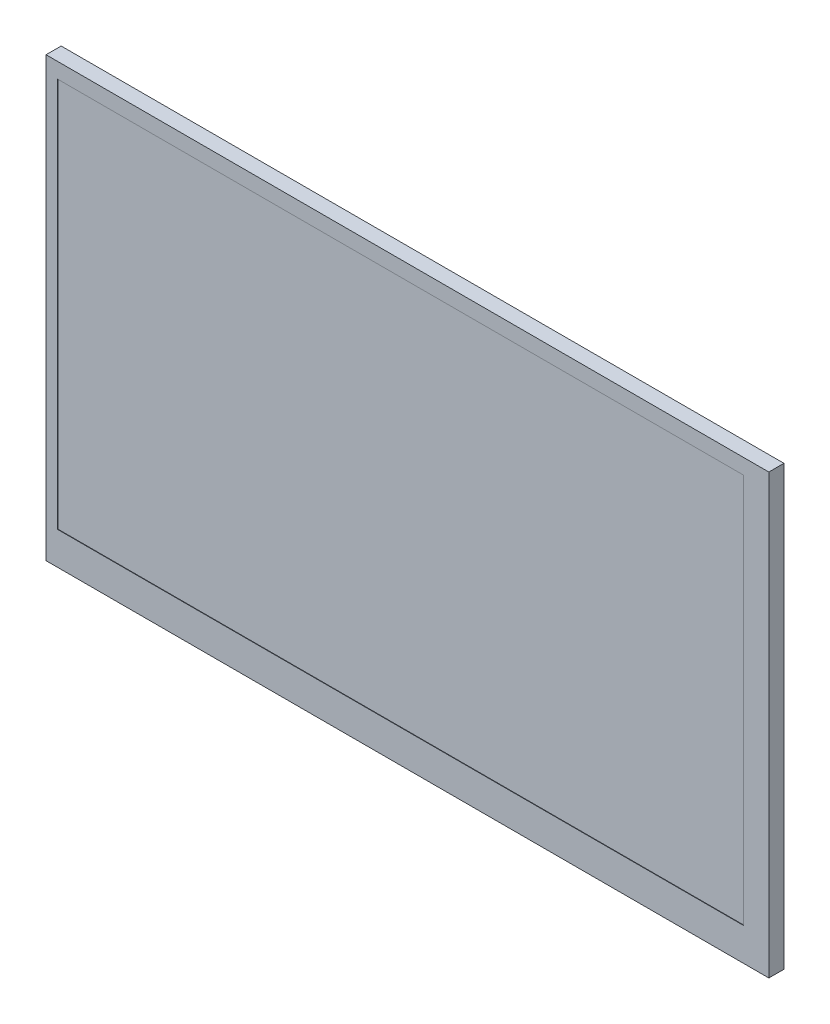
ISO-10303-21;
HEADER;
FILE_DESCRIPTION(('STEP AP214'),'2;1');
FILE_NAME('part.step','',(''),(''),'','','');
FILE_SCHEMA(('AUTOMOTIVE_DESIGN { 1 0 10303 214 1 1 1 1 }'));
ENDSEC;
DATA;
#1=APPLICATION_CONTEXT('core data for automotive mechanical design processes');
#2=APPLICATION_PROTOCOL_DEFINITION('international standard','automotive_design',2000,#1);
#3=PRODUCT_CONTEXT('',#1,'mechanical');
#4=PRODUCT('Part','Part','',(#3));
#5=PRODUCT_RELATED_PRODUCT_CATEGORY('part','',(#4));
#6=PRODUCT_DEFINITION_FORMATION('','',#4);
#7=PRODUCT_DEFINITION_CONTEXT('part definition',#1,'design');
#8=PRODUCT_DEFINITION('design','',#6,#7);
#9=PRODUCT_DEFINITION_SHAPE('','',#8);
#10=(LENGTH_UNIT() NAMED_UNIT(*) SI_UNIT(.MILLI.,.METRE.));
#11=(NAMED_UNIT(*) PLANE_ANGLE_UNIT() SI_UNIT($,.RADIAN.));
#12=(NAMED_UNIT(*) SI_UNIT($,.STERADIAN.) SOLID_ANGLE_UNIT());
#13=UNCERTAINTY_MEASURE_WITH_UNIT(LENGTH_MEASURE(1.E-05),#10,'distance_accuracy_value','');
#14=(GEOMETRIC_REPRESENTATION_CONTEXT(3) GLOBAL_UNCERTAINTY_ASSIGNED_CONTEXT((#13)) GLOBAL_UNIT_ASSIGNED_CONTEXT((#10,
#11,#12)) REPRESENTATION_CONTEXT('',''));
#15=CARTESIAN_POINT('',(0.,0.,0.));
#16=DIRECTION('',(0.,0.,1.));
#17=DIRECTION('',(1.,0.,0.));
#18=AXIS2_PLACEMENT_3D('',#15,#16,#17);
#19=CARTESIAN_POINT('',(-82.475,50.,4.4));
#20=DIRECTION('',(0.,0.,-1.));
#21=DIRECTION('',(-1.,0.,0.));
#22=AXIS2_PLACEMENT_3D('',#19,#20,#21);
#23=PLANE('',#22);
#24=DIRECTION('',(0.,-1.,0.));
#25=VECTOR('',#24,1.);
#26=CARTESIAN_POINT('',(-82.475,-50.,4.4));
#27=LINE('',#26,#25);
#28=CARTESIAN_POINT('',(-82.475,50.,4.4));
#29=VERTEX_POINT('',#28);
#30=CARTESIAN_POINT('',(-82.475,-50.,4.4));
#31=VERTEX_POINT('',#30);
#32=EDGE_CURVE('E136',#29,#31,#27,.T.);
#33=ORIENTED_EDGE('',*,*,#32,.F.);
#34=DIRECTION('',(-1.,0.,0.));
#35=VECTOR('',#34,1.);
#36=CARTESIAN_POINT('',(82.475,50.,4.4));
#37=LINE('',#36,#35);
#38=CARTESIAN_POINT('',(82.475,50.,4.4));
#39=VERTEX_POINT('',#38);
#40=EDGE_CURVE('E142',#39,#29,#37,.T.);
#41=ORIENTED_EDGE('',*,*,#40,.F.);
#42=DIRECTION('',(0.,1.,0.));
#43=VECTOR('',#42,1.);
#44=CARTESIAN_POINT('',(82.4749999999999,-50.,4.4));
#45=LINE('',#44,#43);
#46=CARTESIAN_POINT('',(82.4749999999999,-50.,4.4));
#47=VERTEX_POINT('',#46);
#48=EDGE_CURVE('E154',#47,#39,#45,.T.);
#49=ORIENTED_EDGE('',*,*,#48,.F.);
#50=DIRECTION('',(1.,0.,0.));
#51=VECTOR('',#50,1.);
#52=CARTESIAN_POINT('',(82.4749999999999,-50.,4.4));
#53=LINE('',#52,#51);
#54=EDGE_CURVE('E152',#31,#47,#53,.T.);
#55=ORIENTED_EDGE('',*,*,#54,.F.);
#56=EDGE_LOOP('',(#33,#41,#49,#55));
#57=FACE_BOUND('',#56,.T.);
#58=ADVANCED_FACE('F40',(#57),#23,.T.);
#59=CARTESIAN_POINT('',(0.,0.,7.75));
#60=DIRECTION('',(0.,0.,1.));
#61=DIRECTION('',(1.,0.,0.));
#62=AXIS2_PLACEMENT_3D('',#59,#60,#61);
#63=PLANE('',#62);
#64=DIRECTION('',(0.,-1.,0.));
#65=VECTOR('',#64,1.);
#66=CARTESIAN_POINT('',(-79.855,46.5,7.75));
#67=LINE('',#66,#65);
#68=CARTESIAN_POINT('',(-79.855,46.5,7.75));
#69=VERTEX_POINT('',#68);
#70=CARTESIAN_POINT('',(-79.855,-42.5,7.75));
#71=VERTEX_POINT('',#70);
#72=EDGE_CURVE('E43',#69,#71,#67,.T.);
#73=ORIENTED_EDGE('',*,*,#72,.T.);
#74=DIRECTION('',(1.,0.,0.));
#75=VECTOR('',#74,1.);
#76=CARTESIAN_POINT('',(-79.855,-42.5,7.75));
#77=LINE('',#76,#75);
#78=CARTESIAN_POINT('',(76.645,-42.5,7.75));
#79=VERTEX_POINT('',#78);
#80=EDGE_CURVE('E115',#71,#79,#77,.T.);
#81=ORIENTED_EDGE('',*,*,#80,.T.);
#82=DIRECTION('',(0.,1.,0.));
#83=VECTOR('',#82,1.);
#84=CARTESIAN_POINT('',(76.645,46.5,7.75));
#85=LINE('',#84,#83);
#86=CARTESIAN_POINT('',(76.645,46.5,7.75));
#87=VERTEX_POINT('',#86);
#88=EDGE_CURVE('E129',#79,#87,#85,.T.);
#89=ORIENTED_EDGE('',*,*,#88,.T.);
#90=DIRECTION('',(-1.,0.,0.));
#91=VECTOR('',#90,1.);
#92=CARTESIAN_POINT('',(-79.855,46.5,7.75));
#93=LINE('',#92,#91);
#94=EDGE_CURVE('E117',#87,#69,#93,.T.);
#95=ORIENTED_EDGE('',*,*,#94,.T.);
#96=EDGE_LOOP('',(#73,#81,#89,#95));
#97=FACE_BOUND('',#96,.T.);
#98=ADVANCED_FACE('F196',(#97),#63,.T.);
#99=CARTESIAN_POINT('',(-79.855,-42.5,7.75));
#100=DIRECTION('',(0.,-1.,0.));
#101=DIRECTION('',(0.,0.,-1.));
#102=AXIS2_PLACEMENT_3D('',#99,#100,#101);
#103=PLANE('',#102);
#104=DIRECTION('',(1.,0.,0.));
#105=VECTOR('',#104,1.);
#106=CARTESIAN_POINT('',(-79.855,-42.5,7.85));
#107=LINE('',#106,#105);
#108=CARTESIAN_POINT('',(-79.855,-42.5,7.85));
#109=VERTEX_POINT('',#108);
#110=CARTESIAN_POINT('',(76.645,-42.5,7.85));
#111=VERTEX_POINT('',#110);
#112=EDGE_CURVE('E49',#109,#111,#107,.T.);
#113=ORIENTED_EDGE('',*,*,#112,.T.);
#114=DIRECTION('',(0.,0.,1.));
#115=VECTOR('',#114,1.);
#116=CARTESIAN_POINT('',(76.645,-42.5,7.75));
#117=LINE('',#116,#115);
#118=EDGE_CURVE('E58',#79,#111,#117,.T.);
#119=ORIENTED_EDGE('',*,*,#118,.F.);
#120=ORIENTED_EDGE('',*,*,#80,.F.);
#121=DIRECTION('',(0.,0.,1.));
#122=VECTOR('',#121,1.);
#123=CARTESIAN_POINT('',(-79.855,-42.5,7.75));
#124=LINE('',#123,#122);
#125=EDGE_CURVE('E78',#71,#109,#124,.T.);
#126=ORIENTED_EDGE('',*,*,#125,.T.);
#127=EDGE_LOOP('',(#113,#119,#120,#126));
#128=FACE_BOUND('',#127,.T.);
#129=ADVANCED_FACE('F112',(#128),#103,.F.);
#130=CARTESIAN_POINT('',(76.645,46.5,7.75));
#131=DIRECTION('',(1.,0.,0.));
#132=DIRECTION('',(0.,0.,-1.));
#133=AXIS2_PLACEMENT_3D('',#130,#131,#132);
#134=PLANE('',#133);
#135=DIRECTION('',(0.,1.,0.));
#136=VECTOR('',#135,1.);
#137=CARTESIAN_POINT('',(76.645,46.5,7.85));
#138=LINE('',#137,#136);
#139=CARTESIAN_POINT('',(76.645,46.5,7.85));
#140=VERTEX_POINT('',#139);
#141=EDGE_CURVE('E121',#111,#140,#138,.T.);
#142=ORIENTED_EDGE('',*,*,#141,.T.);
#143=DIRECTION('',(0.,0.,1.));
#144=VECTOR('',#143,1.);
#145=CARTESIAN_POINT('',(76.645,46.5,7.75));
#146=LINE('',#145,#144);
#147=EDGE_CURVE('E135',#87,#140,#146,.T.);
#148=ORIENTED_EDGE('',*,*,#147,.F.);
#149=ORIENTED_EDGE('',*,*,#88,.F.);
#150=ORIENTED_EDGE('',*,*,#118,.T.);
#151=EDGE_LOOP('',(#142,#148,#149,#150));
#152=FACE_BOUND('',#151,.T.);
#153=ADVANCED_FACE('F202',(#152),#134,.F.);
#154=CARTESIAN_POINT('',(-79.855,46.5,7.75));
#155=DIRECTION('',(0.,1.,0.));
#156=DIRECTION('',(0.,0.,1.));
#157=AXIS2_PLACEMENT_3D('',#154,#155,#156);
#158=PLANE('',#157);
#159=DIRECTION('',(-1.,0.,0.));
#160=VECTOR('',#159,1.);
#161=CARTESIAN_POINT('',(-79.855,46.5,7.85));
#162=LINE('',#161,#160);
#163=CARTESIAN_POINT('',(-79.855,46.5,7.85));
#164=VERTEX_POINT('',#163);
#165=EDGE_CURVE('E123',#140,#164,#162,.T.);
#166=ORIENTED_EDGE('',*,*,#165,.T.);
#167=DIRECTION('',(0.,0.,1.));
#168=VECTOR('',#167,1.);
#169=CARTESIAN_POINT('',(-79.855,46.5,7.75));
#170=LINE('',#169,#168);
#171=EDGE_CURVE('E80',#69,#164,#170,.T.);
#172=ORIENTED_EDGE('',*,*,#171,.F.);
#173=ORIENTED_EDGE('',*,*,#94,.F.);
#174=ORIENTED_EDGE('',*,*,#147,.T.);
#175=EDGE_LOOP('',(#166,#172,#173,#174));
#176=FACE_BOUND('',#175,.T.);
#177=ADVANCED_FACE('F205',(#176),#158,.F.);
#178=CARTESIAN_POINT('',(-79.855,46.5,7.75));
#179=DIRECTION('',(-1.,0.,0.));
#180=DIRECTION('',(0.,-1.,0.));
#181=AXIS2_PLACEMENT_3D('',#178,#179,#180);
#182=PLANE('',#181);
#183=DIRECTION('',(0.,-1.,0.));
#184=VECTOR('',#183,1.);
#185=CARTESIAN_POINT('',(-79.855,46.5,7.85));
#186=LINE('',#185,#184);
#187=EDGE_CURVE('E11',#164,#109,#186,.T.);
#188=ORIENTED_EDGE('',*,*,#187,.T.);
#189=ORIENTED_EDGE('',*,*,#125,.F.);
#190=ORIENTED_EDGE('',*,*,#72,.F.);
#191=ORIENTED_EDGE('',*,*,#171,.T.);
#192=EDGE_LOOP('',(#188,#189,#190,#191));
#193=FACE_BOUND('',#192,.T.);
#194=ADVANCED_FACE('F108',(#193),#182,.F.);
#195=CARTESIAN_POINT('',(82.4749999999999,-50.,7.85));
#196=DIRECTION('',(0.,1.,0.));
#197=DIRECTION('',(-1.,0.,0.));
#198=AXIS2_PLACEMENT_3D('',#195,#196,#197);
#199=PLANE('',#198);
#200=ORIENTED_EDGE('',*,*,#54,.T.);
#201=DIRECTION('',(0.,0.,-1.));
#202=VECTOR('',#201,1.);
#203=CARTESIAN_POINT('',(82.4749999999999,-50.,7.85));
#204=LINE('',#203,#202);
#205=CARTESIAN_POINT('',(82.4749999999999,-50.,7.85));
#206=VERTEX_POINT('',#205);
#207=EDGE_CURVE('E162',#206,#47,#204,.T.);
#208=ORIENTED_EDGE('',*,*,#207,.F.);
#209=DIRECTION('',(1.,0.,0.));
#210=VECTOR('',#209,1.);
#211=CARTESIAN_POINT('',(82.4749999999999,-50.,7.85));
#212=LINE('',#211,#210);
#213=CARTESIAN_POINT('',(-82.475,-50.,7.85));
#214=VERTEX_POINT('',#213);
#215=EDGE_CURVE('E143',#214,#206,#212,.T.);
#216=ORIENTED_EDGE('',*,*,#215,.F.);
#217=DIRECTION('',(0.,0.,-1.));
#218=VECTOR('',#217,1.);
#219=CARTESIAN_POINT('',(-82.475,-50.,7.85));
#220=LINE('',#219,#218);
#221=EDGE_CURVE('E165',#214,#31,#220,.T.);
#222=ORIENTED_EDGE('',*,*,#221,.T.);
#223=EDGE_LOOP('',(#200,#208,#216,#222));
#224=FACE_BOUND('',#223,.T.);
#225=ADVANCED_FACE('F169',(#224),#199,.F.);
#226=CARTESIAN_POINT('',(82.4749999999999,-50.,7.85));
#227=DIRECTION('',(-1.,0.,0.));
#228=DIRECTION('',(0.,-1.,0.));
#229=AXIS2_PLACEMENT_3D('',#226,#227,#228);
#230=PLANE('',#229);
#231=ORIENTED_EDGE('',*,*,#48,.T.);
#232=DIRECTION('',(0.,0.,-1.));
#233=VECTOR('',#232,1.);
#234=CARTESIAN_POINT('',(82.475,50.,7.85));
#235=LINE('',#234,#233);
#236=CARTESIAN_POINT('',(82.475,50.,7.85));
#237=VERTEX_POINT('',#236);
#238=EDGE_CURVE('E159',#237,#39,#235,.T.);
#239=ORIENTED_EDGE('',*,*,#238,.F.);
#240=DIRECTION('',(0.,1.,0.));
#241=VECTOR('',#240,1.);
#242=CARTESIAN_POINT('',(82.4749999999999,-50.,7.85));
#243=LINE('',#242,#241);
#244=EDGE_CURVE('E145',#206,#237,#243,.T.);
#245=ORIENTED_EDGE('',*,*,#244,.F.);
#246=ORIENTED_EDGE('',*,*,#207,.T.);
#247=EDGE_LOOP('',(#231,#239,#245,#246));
#248=FACE_BOUND('',#247,.T.);
#249=ADVANCED_FACE('F181',(#248),#230,.F.);
#250=CARTESIAN_POINT('',(0.,0.,7.85));
#251=DIRECTION('',(0.,0.,1.));
#252=DIRECTION('',(1.,0.,0.));
#253=AXIS2_PLACEMENT_3D('',#250,#251,#252);
#254=PLANE('',#253);
#255=ORIENTED_EDGE('',*,*,#187,.F.);
#256=ORIENTED_EDGE('',*,*,#165,.F.);
#257=ORIENTED_EDGE('',*,*,#141,.F.);
#258=ORIENTED_EDGE('',*,*,#112,.F.);
#259=EDGE_LOOP('',(#255,#256,#257,#258));
#260=FACE_BOUND('',#259,.T.);
#261=DIRECTION('',(0.,-1.,0.));
#262=VECTOR('',#261,1.);
#263=CARTESIAN_POINT('',(-82.475,-50.,7.85));
#264=LINE('',#263,#262);
#265=CARTESIAN_POINT('',(-82.475,50.,7.85));
#266=VERTEX_POINT('',#265);
#267=EDGE_CURVE('E139',#266,#214,#264,.T.);
#268=ORIENTED_EDGE('',*,*,#267,.T.);
#269=ORIENTED_EDGE('',*,*,#215,.T.);
#270=ORIENTED_EDGE('',*,*,#244,.T.);
#271=DIRECTION('',(-1.,0.,0.));
#272=VECTOR('',#271,1.);
#273=CARTESIAN_POINT('',(82.475,50.,7.85));
#274=LINE('',#273,#272);
#275=EDGE_CURVE('E147',#237,#266,#274,.T.);
#276=ORIENTED_EDGE('',*,*,#275,.T.);
#277=EDGE_LOOP('',(#268,#269,#270,#276));
#278=FACE_BOUND('',#277,.T.);
#279=ADVANCED_FACE('F119',(#260,#278),#254,.T.);
#280=CARTESIAN_POINT('',(-82.475,-50.,7.85));
#281=DIRECTION('',(1.,0.,0.));
#282=DIRECTION('',(0.,0.,-1.));
#283=AXIS2_PLACEMENT_3D('',#280,#281,#282);
#284=PLANE('',#283);
#285=ORIENTED_EDGE('',*,*,#32,.T.);
#286=ORIENTED_EDGE('',*,*,#221,.F.);
#287=ORIENTED_EDGE('',*,*,#267,.F.);
#288=DIRECTION('',(0.,0.,-1.));
#289=VECTOR('',#288,1.);
#290=CARTESIAN_POINT('',(-82.475,50.,7.85));
#291=LINE('',#290,#289);
#292=EDGE_CURVE('E149',#266,#29,#291,.T.);
#293=ORIENTED_EDGE('',*,*,#292,.T.);
#294=EDGE_LOOP('',(#285,#286,#287,#293));
#295=FACE_BOUND('',#294,.T.);
#296=ADVANCED_FACE('F174',(#295),#284,.F.);
#297=CARTESIAN_POINT('',(82.475,50.,7.85));
#298=DIRECTION('',(0.,-1.,0.));
#299=DIRECTION('',(1.,0.,0.));
#300=AXIS2_PLACEMENT_3D('',#297,#298,#299);
#301=PLANE('',#300);
#302=ORIENTED_EDGE('',*,*,#40,.T.);
#303=ORIENTED_EDGE('',*,*,#292,.F.);
#304=ORIENTED_EDGE('',*,*,#275,.F.);
#305=ORIENTED_EDGE('',*,*,#238,.T.);
#306=EDGE_LOOP('',(#302,#303,#304,#305));
#307=FACE_BOUND('',#306,.T.);
#308=ADVANCED_FACE('F185',(#307),#301,.F.);
#309=CLOSED_SHELL('',(#58,#98,#129,#153,#177,#194,#225,#249,#279,#296,#308));
#310=MANIFOLD_SOLID_BREP('B2',#309);
#311=ADVANCED_BREP_SHAPE_REPRESENTATION('',(#18,#310),#14);
#312=SHAPE_DEFINITION_REPRESENTATION(#9,#311);
ENDSEC;
END-ISO-10303-21;
